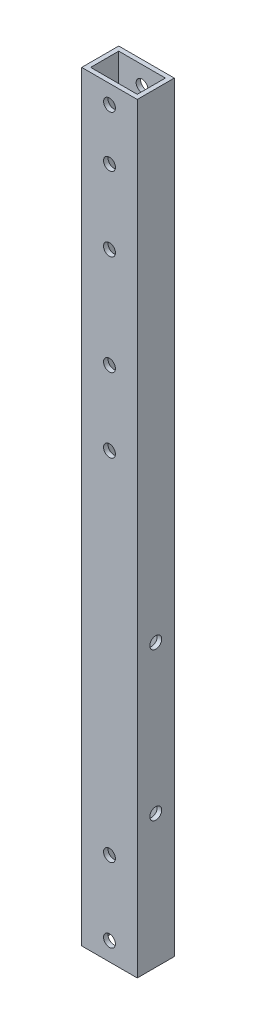
ISO-10303-21;
HEADER;
FILE_DESCRIPTION(('STEP AP214'),'2;1');
FILE_NAME('part.step','',(''),(''),'','','');
FILE_SCHEMA(('AUTOMOTIVE_DESIGN { 1 0 10303 214 1 1 1 1 }'));
ENDSEC;
DATA;
#1=APPLICATION_CONTEXT('core data for automotive mechanical design processes');
#2=APPLICATION_PROTOCOL_DEFINITION('international standard','automotive_design',2000,#1);
#3=PRODUCT_CONTEXT('',#1,'mechanical');
#4=PRODUCT('Part','Part','',(#3));
#5=PRODUCT_RELATED_PRODUCT_CATEGORY('part','',(#4));
#6=PRODUCT_DEFINITION_FORMATION('','',#4);
#7=PRODUCT_DEFINITION_CONTEXT('part definition',#1,'design');
#8=PRODUCT_DEFINITION('design','',#6,#7);
#9=PRODUCT_DEFINITION_SHAPE('','',#8);
#10=(LENGTH_UNIT() NAMED_UNIT(*) SI_UNIT(.MILLI.,.METRE.));
#11=(NAMED_UNIT(*) PLANE_ANGLE_UNIT() SI_UNIT($,.RADIAN.));
#12=(NAMED_UNIT(*) SI_UNIT($,.STERADIAN.) SOLID_ANGLE_UNIT());
#13=UNCERTAINTY_MEASURE_WITH_UNIT(LENGTH_MEASURE(1.E-05),#10,'distance_accuracy_value','');
#14=(GEOMETRIC_REPRESENTATION_CONTEXT(3) GLOBAL_UNCERTAINTY_ASSIGNED_CONTEXT((#13)) GLOBAL_UNIT_ASSIGNED_CONTEXT((#10,
#11,#12)) REPRESENTATION_CONTEXT('',''));
#15=CARTESIAN_POINT('',(0.,0.,0.));
#16=DIRECTION('',(0.,0.,1.));
#17=DIRECTION('',(1.,0.,0.));
#18=AXIS2_PLACEMENT_3D('',#15,#16,#17);
#19=CARTESIAN_POINT('',(7.5,110.,-5.));
#20=DIRECTION('',(-1.,0.,0.));
#21=DIRECTION('',(0.,0.,1.));
#22=AXIS2_PLACEMENT_3D('',#19,#20,#21);
#23=PLANE('',#22);
#24=CARTESIAN_POINT('',(7.5,-74.,0.));
#25=DIRECTION('',(1.,0.,0.));
#26=DIRECTION('',(0.,0.,-1.));
#27=AXIS2_PLACEMENT_3D('',#24,#25,#26);
#28=CIRCLE('',#27,1.60000000000001);
#29=CARTESIAN_POINT('',(7.5,-74.,-1.60000000000001));
#30=VERTEX_POINT('',#29);
#31=EDGE_CURVE('E261',#30,#30,#28,.T.);
#32=ORIENTED_EDGE('',*,*,#31,.F.);
#33=EDGE_LOOP('',(#32));
#34=FACE_BOUND('',#33,.T.);
#35=CARTESIAN_POINT('',(7.5,-34.,0.));
#36=DIRECTION('',(1.,0.,0.));
#37=DIRECTION('',(0.,0.,-1.));
#38=AXIS2_PLACEMENT_3D('',#35,#36,#37);
#39=CIRCLE('',#38,1.6);
#40=CARTESIAN_POINT('',(7.5,-34.,-1.6));
#41=VERTEX_POINT('',#40);
#42=EDGE_CURVE('E265',#41,#41,#39,.T.);
#43=ORIENTED_EDGE('',*,*,#42,.F.);
#44=EDGE_LOOP('',(#43));
#45=FACE_BOUND('',#44,.T.);
#46=DIRECTION('',(0.,0.,-1.));
#47=VECTOR('',#46,1.);
#48=CARTESIAN_POINT('',(7.5,95.5,5.));
#49=LINE('',#48,#47);
#50=CARTESIAN_POINT('',(7.5,95.5,5.));
#51=VERTEX_POINT('',#50);
#52=CARTESIAN_POINT('',(7.5,95.5,-5.));
#53=VERTEX_POINT('',#52);
#54=EDGE_CURVE('E111',#51,#53,#49,.T.);
#55=ORIENTED_EDGE('',*,*,#54,.F.);
#56=DIRECTION('',(0.,-1.,0.));
#57=VECTOR('',#56,1.);
#58=CARTESIAN_POINT('',(7.5,110.,5.));
#59=LINE('',#58,#57);
#60=CARTESIAN_POINT('',(7.5,-110.,5.));
#61=VERTEX_POINT('',#60);
#62=EDGE_CURVE('E122',#51,#61,#59,.T.);
#63=ORIENTED_EDGE('',*,*,#62,.T.);
#64=DIRECTION('',(0.,0.,-1.));
#65=VECTOR('',#64,1.);
#66=CARTESIAN_POINT('',(7.5,-110.,-5.));
#67=LINE('',#66,#65);
#68=CARTESIAN_POINT('',(7.5,-110.,-5.));
#69=VERTEX_POINT('',#68);
#70=EDGE_CURVE('E330',#61,#69,#67,.T.);
#71=ORIENTED_EDGE('',*,*,#70,.T.);
#72=DIRECTION('',(0.,-1.,0.));
#73=VECTOR('',#72,1.);
#74=CARTESIAN_POINT('',(7.5,110.,-5.));
#75=LINE('',#74,#73);
#76=EDGE_CURVE('E54',#53,#69,#75,.T.);
#77=ORIENTED_EDGE('',*,*,#76,.F.);
#78=EDGE_LOOP('',(#55,#63,#71,#77));
#79=FACE_BOUND('',#78,.T.);
#80=ADVANCED_FACE('F45',(#34,#45,#79),#23,.F.);
#81=CARTESIAN_POINT('',(-7.5,110.,-5.));
#82=DIRECTION('',(0.,0.,1.));
#83=DIRECTION('',(1.,0.,0.));
#84=AXIS2_PLACEMENT_3D('',#81,#82,#83);
#85=PLANE('',#84);
#86=CARTESIAN_POINT('',(0.,9.60000000000005,-5.));
#87=DIRECTION('',(0.,0.,-1.));
#88=DIRECTION('',(-1.,0.,0.));
#89=AXIS2_PLACEMENT_3D('',#86,#87,#88);
#90=CIRCLE('',#89,1.6);
#91=CARTESIAN_POINT('',(-1.59999999999996,9.60000000000005,-5.));
#92=VERTEX_POINT('',#91);
#93=EDGE_CURVE('E198',#92,#92,#90,.T.);
#94=ORIENTED_EDGE('',*,*,#93,.F.);
#95=EDGE_LOOP('',(#94));
#96=FACE_BOUND('',#95,.T.);
#97=CARTESIAN_POINT('',(0.,29.6000000000001,-5.));
#98=DIRECTION('',(0.,0.,-1.));
#99=DIRECTION('',(-1.,0.,0.));
#100=AXIS2_PLACEMENT_3D('',#97,#98,#99);
#101=CIRCLE('',#100,1.6);
#102=CARTESIAN_POINT('',(-1.59999999999998,29.6000000000001,-5.));
#103=VERTEX_POINT('',#102);
#104=EDGE_CURVE('E204',#103,#103,#101,.T.);
#105=ORIENTED_EDGE('',*,*,#104,.F.);
#106=EDGE_LOOP('',(#105));
#107=FACE_BOUND('',#106,.T.);
#108=CARTESIAN_POINT('',(0.,90.5,-5.));
#109=DIRECTION('',(0.,0.,-1.));
#110=DIRECTION('',(-1.,0.,0.));
#111=AXIS2_PLACEMENT_3D('',#108,#109,#110);
#112=CIRCLE('',#111,1.6);
#113=CARTESIAN_POINT('',(-1.6,90.5,-5.));
#114=VERTEX_POINT('',#113);
#115=EDGE_CURVE('E174',#114,#114,#112,.T.);
#116=ORIENTED_EDGE('',*,*,#115,.F.);
#117=EDGE_LOOP('',(#116));
#118=FACE_BOUND('',#117,.T.);
#119=CARTESIAN_POINT('',(0.,76.66,-5.));
#120=DIRECTION('',(0.,0.,-1.));
#121=DIRECTION('',(-1.,0.,0.));
#122=AXIS2_PLACEMENT_3D('',#119,#120,#121);
#123=CIRCLE('',#122,1.6);
#124=CARTESIAN_POINT('',(-1.6,76.66,-5.));
#125=VERTEX_POINT('',#124);
#126=EDGE_CURVE('E222',#125,#125,#123,.T.);
#127=ORIENTED_EDGE('',*,*,#126,.F.);
#128=EDGE_LOOP('',(#127));
#129=FACE_BOUND('',#128,.T.);
#130=CARTESIAN_POINT('',(0.,56.66,-5.));
#131=DIRECTION('',(0.,0.,-1.));
#132=DIRECTION('',(-1.,0.,0.));
#133=AXIS2_PLACEMENT_3D('',#130,#131,#132);
#134=CIRCLE('',#133,1.6);
#135=CARTESIAN_POINT('',(-1.6,56.66,-5.));
#136=VERTEX_POINT('',#135);
#137=EDGE_CURVE('E218',#136,#136,#134,.T.);
#138=ORIENTED_EDGE('',*,*,#137,.F.);
#139=EDGE_LOOP('',(#138));
#140=FACE_BOUND('',#139,.T.);
#141=CARTESIAN_POINT('',(0.,-105.,-5.));
#142=DIRECTION('',(0.,0.,-1.));
#143=DIRECTION('',(-1.,0.,0.));
#144=AXIS2_PLACEMENT_3D('',#141,#142,#143);
#145=CIRCLE('',#144,1.60000000000001);
#146=CARTESIAN_POINT('',(-1.60000000000001,-105.,-5.));
#147=VERTEX_POINT('',#146);
#148=EDGE_CURVE('E282',#147,#147,#145,.T.);
#149=ORIENTED_EDGE('',*,*,#148,.F.);
#150=EDGE_LOOP('',(#149));
#151=FACE_BOUND('',#150,.T.);
#152=CARTESIAN_POINT('',(0.,-85.,-5.));
#153=DIRECTION('',(0.,0.,-1.));
#154=DIRECTION('',(-1.,0.,0.));
#155=AXIS2_PLACEMENT_3D('',#152,#153,#154);
#156=CIRCLE('',#155,1.6);
#157=CARTESIAN_POINT('',(-1.6,-85.,-5.));
#158=VERTEX_POINT('',#157);
#159=EDGE_CURVE('E151',#158,#158,#156,.T.);
#160=ORIENTED_EDGE('',*,*,#159,.F.);
#161=EDGE_LOOP('',(#160));
#162=FACE_BOUND('',#161,.T.);
#163=DIRECTION('',(-1.,0.,0.));
#164=VECTOR('',#163,1.);
#165=CARTESIAN_POINT('',(7.5,95.5,-5.));
#166=LINE('',#165,#164);
#167=CARTESIAN_POINT('',(-7.5,95.5,-5.));
#168=VERTEX_POINT('',#167);
#169=EDGE_CURVE('E125',#53,#168,#166,.T.);
#170=ORIENTED_EDGE('',*,*,#169,.F.);
#171=ORIENTED_EDGE('',*,*,#76,.T.);
#172=DIRECTION('',(-1.,0.,0.));
#173=VECTOR('',#172,1.);
#174=CARTESIAN_POINT('',(-7.5,-110.,-5.));
#175=LINE('',#174,#173);
#176=CARTESIAN_POINT('',(-7.5,-110.,-5.));
#177=VERTEX_POINT('',#176);
#178=EDGE_CURVE('E333',#69,#177,#175,.T.);
#179=ORIENTED_EDGE('',*,*,#178,.T.);
#180=DIRECTION('',(0.,-1.,0.));
#181=VECTOR('',#180,1.);
#182=CARTESIAN_POINT('',(-7.5,110.,-5.));
#183=LINE('',#182,#181);
#184=EDGE_CURVE('E136',#168,#177,#183,.T.);
#185=ORIENTED_EDGE('',*,*,#184,.F.);
#186=EDGE_LOOP('',(#170,#171,#179,#185));
#187=FACE_BOUND('',#186,.T.);
#188=ADVANCED_FACE('F347',(#96,#107,#118,#129,#140,#151,#162,#187),#85,.F.);
#189=CARTESIAN_POINT('',(-7.5,110.,-5.));
#190=DIRECTION('',(1.,0.,0.));
#191=DIRECTION('',(0.,0.,-1.));
#192=AXIS2_PLACEMENT_3D('',#189,#190,#191);
#193=PLANE('',#192);
#194=CARTESIAN_POINT('',(-7.5,-74.,0.));
#195=DIRECTION('',(1.,0.,0.));
#196=DIRECTION('',(0.,0.,-1.));
#197=AXIS2_PLACEMENT_3D('',#194,#195,#196);
#198=CIRCLE('',#197,1.60000000000001);
#199=CARTESIAN_POINT('',(-7.5,-74.,-1.60000000000001));
#200=VERTEX_POINT('',#199);
#201=EDGE_CURVE('E269',#200,#200,#198,.T.);
#202=ORIENTED_EDGE('',*,*,#201,.T.);
#203=EDGE_LOOP('',(#202));
#204=FACE_BOUND('',#203,.T.);
#205=CARTESIAN_POINT('',(-7.5,-34.,0.));
#206=DIRECTION('',(1.,0.,0.));
#207=DIRECTION('',(0.,0.,-1.));
#208=AXIS2_PLACEMENT_3D('',#205,#206,#207);
#209=CIRCLE('',#208,1.6);
#210=CARTESIAN_POINT('',(-7.5,-34.,-1.6));
#211=VERTEX_POINT('',#210);
#212=EDGE_CURVE('E163',#211,#211,#209,.T.);
#213=ORIENTED_EDGE('',*,*,#212,.T.);
#214=EDGE_LOOP('',(#213));
#215=FACE_BOUND('',#214,.T.);
#216=DIRECTION('',(0.,0.,1.));
#217=VECTOR('',#216,1.);
#218=CARTESIAN_POINT('',(-7.5,95.5,-5.));
#219=LINE('',#218,#217);
#220=CARTESIAN_POINT('',(-7.5,95.5,5.));
#221=VERTEX_POINT('',#220);
#222=EDGE_CURVE('E62',#168,#221,#219,.T.);
#223=ORIENTED_EDGE('',*,*,#222,.F.);
#224=ORIENTED_EDGE('',*,*,#184,.T.);
#225=DIRECTION('',(0.,0.,1.));
#226=VECTOR('',#225,1.);
#227=CARTESIAN_POINT('',(-7.5,-110.,-5.));
#228=LINE('',#227,#226);
#229=CARTESIAN_POINT('',(-7.5,-110.,5.));
#230=VERTEX_POINT('',#229);
#231=EDGE_CURVE('E138',#177,#230,#228,.T.);
#232=ORIENTED_EDGE('',*,*,#231,.T.);
#233=DIRECTION('',(0.,-1.,0.));
#234=VECTOR('',#233,1.);
#235=CARTESIAN_POINT('',(-7.5,110.,5.));
#236=LINE('',#235,#234);
#237=EDGE_CURVE('E132',#221,#230,#236,.T.);
#238=ORIENTED_EDGE('',*,*,#237,.F.);
#239=EDGE_LOOP('',(#223,#224,#232,#238));
#240=FACE_BOUND('',#239,.T.);
#241=ADVANCED_FACE('F340',(#204,#215,#240),#193,.F.);
#242=CARTESIAN_POINT('',(-7.5,110.,5.));
#243=DIRECTION('',(0.,0.,-1.));
#244=DIRECTION('',(-1.,0.,0.));
#245=AXIS2_PLACEMENT_3D('',#242,#243,#244);
#246=PLANE('',#245);
#247=CARTESIAN_POINT('',(0.,9.60000000000005,5.));
#248=DIRECTION('',(0.,0.,-1.));
#249=DIRECTION('',(-1.,0.,0.));
#250=AXIS2_PLACEMENT_3D('',#247,#248,#249);
#251=CIRCLE('',#250,1.6);
#252=CARTESIAN_POINT('',(-1.59999999999996,9.60000000000005,5.));
#253=VERTEX_POINT('',#252);
#254=EDGE_CURVE('E190',#253,#253,#251,.T.);
#255=ORIENTED_EDGE('',*,*,#254,.T.);
#256=EDGE_LOOP('',(#255));
#257=FACE_BOUND('',#256,.T.);
#258=CARTESIAN_POINT('',(0.,29.6000000000001,5.));
#259=DIRECTION('',(0.,0.,-1.));
#260=DIRECTION('',(-1.,0.,0.));
#261=AXIS2_PLACEMENT_3D('',#258,#259,#260);
#262=CIRCLE('',#261,1.6);
#263=CARTESIAN_POINT('',(-1.59999999999998,29.6000000000001,5.));
#264=VERTEX_POINT('',#263);
#265=EDGE_CURVE('E210',#264,#264,#262,.T.);
#266=ORIENTED_EDGE('',*,*,#265,.T.);
#267=EDGE_LOOP('',(#266));
#268=FACE_BOUND('',#267,.T.);
#269=CARTESIAN_POINT('',(0.,90.5,5.));
#270=DIRECTION('',(0.,0.,-1.));
#271=DIRECTION('',(-1.,0.,0.));
#272=AXIS2_PLACEMENT_3D('',#269,#270,#271);
#273=CIRCLE('',#272,1.6);
#274=CARTESIAN_POINT('',(-1.6,90.5,5.));
#275=VERTEX_POINT('',#274);
#276=EDGE_CURVE('E117',#275,#275,#273,.T.);
#277=ORIENTED_EDGE('',*,*,#276,.T.);
#278=EDGE_LOOP('',(#277));
#279=FACE_BOUND('',#278,.T.);
#280=CARTESIAN_POINT('',(0.,76.66,5.));
#281=DIRECTION('',(0.,0.,-1.));
#282=DIRECTION('',(-1.,0.,0.));
#283=AXIS2_PLACEMENT_3D('',#280,#281,#282);
#284=CIRCLE('',#283,1.6);
#285=CARTESIAN_POINT('',(-1.6,76.66,5.));
#286=VERTEX_POINT('',#285);
#287=EDGE_CURVE('E185',#286,#286,#284,.T.);
#288=ORIENTED_EDGE('',*,*,#287,.T.);
#289=EDGE_LOOP('',(#288));
#290=FACE_BOUND('',#289,.T.);
#291=CARTESIAN_POINT('',(0.,56.66,5.));
#292=DIRECTION('',(0.,0.,-1.));
#293=DIRECTION('',(-1.,0.,0.));
#294=AXIS2_PLACEMENT_3D('',#291,#292,#293);
#295=CIRCLE('',#294,1.6);
#296=CARTESIAN_POINT('',(-1.6,56.66,5.));
#297=VERTEX_POINT('',#296);
#298=EDGE_CURVE('E180',#297,#297,#295,.T.);
#299=ORIENTED_EDGE('',*,*,#298,.T.);
#300=EDGE_LOOP('',(#299));
#301=FACE_BOUND('',#300,.T.);
#302=CARTESIAN_POINT('',(0.,-105.,5.));
#303=DIRECTION('',(0.,0.,-1.));
#304=DIRECTION('',(-1.,0.,0.));
#305=AXIS2_PLACEMENT_3D('',#302,#303,#304);
#306=CIRCLE('',#305,1.60000000000001);
#307=CARTESIAN_POINT('',(-1.60000000000001,-105.,5.));
#308=VERTEX_POINT('',#307);
#309=EDGE_CURVE('E157',#308,#308,#306,.T.);
#310=ORIENTED_EDGE('',*,*,#309,.T.);
#311=EDGE_LOOP('',(#310));
#312=FACE_BOUND('',#311,.T.);
#313=CARTESIAN_POINT('',(0.,-85.,5.));
#314=DIRECTION('',(0.,0.,-1.));
#315=DIRECTION('',(-1.,0.,0.));
#316=AXIS2_PLACEMENT_3D('',#313,#314,#315);
#317=CIRCLE('',#316,1.6);
#318=CARTESIAN_POINT('',(-1.6,-85.,5.));
#319=VERTEX_POINT('',#318);
#320=EDGE_CURVE('E298',#319,#319,#317,.T.);
#321=ORIENTED_EDGE('',*,*,#320,.T.);
#322=EDGE_LOOP('',(#321));
#323=FACE_BOUND('',#322,.T.);
#324=DIRECTION('',(1.,0.,0.));
#325=VECTOR('',#324,1.);
#326=CARTESIAN_POINT('',(-7.5,95.5,5.));
#327=LINE('',#326,#325);
#328=EDGE_CURVE('E108',#221,#51,#327,.T.);
#329=ORIENTED_EDGE('',*,*,#328,.F.);
#330=ORIENTED_EDGE('',*,*,#237,.T.);
#331=DIRECTION('',(1.,0.,0.));
#332=VECTOR('',#331,1.);
#333=CARTESIAN_POINT('',(-7.5,-110.,5.));
#334=LINE('',#333,#332);
#335=EDGE_CURVE('E129',#230,#61,#334,.T.);
#336=ORIENTED_EDGE('',*,*,#335,.T.);
#337=ORIENTED_EDGE('',*,*,#62,.F.);
#338=EDGE_LOOP('',(#329,#330,#336,#337));
#339=FACE_BOUND('',#338,.T.);
#340=ADVANCED_FACE('F127',(#257,#268,#279,#290,#301,#312,#323,#339),#246,.F.);
#341=CARTESIAN_POINT('',(-6.3,110.,-3.8));
#342=DIRECTION('',(1.,0.,0.));
#343=DIRECTION('',(0.,0.,-1.));
#344=AXIS2_PLACEMENT_3D('',#341,#342,#343);
#345=PLANE('',#344);
#346=CARTESIAN_POINT('',(-6.3,-34.,0.));
#347=DIRECTION('',(1.,0.,0.));
#348=DIRECTION('',(0.,0.,-1.));
#349=AXIS2_PLACEMENT_3D('',#346,#347,#348);
#350=CIRCLE('',#349,1.6);
#351=CARTESIAN_POINT('',(-6.3,-34.,-1.6));
#352=VERTEX_POINT('',#351);
#353=EDGE_CURVE('E167',#352,#352,#350,.T.);
#354=ORIENTED_EDGE('',*,*,#353,.F.);
#355=EDGE_LOOP('',(#354));
#356=FACE_BOUND('',#355,.T.);
#357=CARTESIAN_POINT('',(-6.3,-74.,0.));
#358=DIRECTION('',(1.,0.,0.));
#359=DIRECTION('',(0.,0.,-1.));
#360=AXIS2_PLACEMENT_3D('',#357,#358,#359);
#361=CIRCLE('',#360,1.60000000000001);
#362=CARTESIAN_POINT('',(-6.3,-74.,-1.60000000000001));
#363=VERTEX_POINT('',#362);
#364=EDGE_CURVE('E162',#363,#363,#361,.T.);
#365=ORIENTED_EDGE('',*,*,#364,.F.);
#366=EDGE_LOOP('',(#365));
#367=FACE_BOUND('',#366,.T.);
#368=DIRECTION('',(0.,-1.,0.));
#369=VECTOR('',#368,1.);
#370=CARTESIAN_POINT('',(-6.3,110.,-3.8));
#371=LINE('',#370,#369);
#372=CARTESIAN_POINT('',(-6.3,95.5,-3.8));
#373=VERTEX_POINT('',#372);
#374=CARTESIAN_POINT('',(-6.3,-110.,-3.8));
#375=VERTEX_POINT('',#374);
#376=EDGE_CURVE('E318',#373,#375,#371,.T.);
#377=ORIENTED_EDGE('',*,*,#376,.F.);
#378=DIRECTION('',(0.,0.,1.));
#379=VECTOR('',#378,1.);
#380=CARTESIAN_POINT('',(-6.3,95.5,-3.8));
#381=LINE('',#380,#379);
#382=CARTESIAN_POINT('',(-6.3,95.5,3.8));
#383=VERTEX_POINT('',#382);
#384=EDGE_CURVE('E70',#373,#383,#381,.T.);
#385=ORIENTED_EDGE('',*,*,#384,.T.);
#386=DIRECTION('',(0.,-1.,0.));
#387=VECTOR('',#386,1.);
#388=CARTESIAN_POINT('',(-6.3,110.,3.8));
#389=LINE('',#388,#387);
#390=CARTESIAN_POINT('',(-6.3,-110.,3.8));
#391=VERTEX_POINT('',#390);
#392=EDGE_CURVE('E327',#383,#391,#389,.T.);
#393=ORIENTED_EDGE('',*,*,#392,.T.);
#394=DIRECTION('',(0.,0.,1.));
#395=VECTOR('',#394,1.);
#396=CARTESIAN_POINT('',(-6.3,-110.,-3.8));
#397=LINE('',#396,#395);
#398=EDGE_CURVE('E302',#375,#391,#397,.T.);
#399=ORIENTED_EDGE('',*,*,#398,.F.);
#400=EDGE_LOOP('',(#377,#385,#393,#399));
#401=FACE_BOUND('',#400,.T.);
#402=ADVANCED_FACE('F363',(#356,#367,#401),#345,.T.);
#403=CARTESIAN_POINT('',(-6.3,110.,3.8));
#404=DIRECTION('',(0.,0.,-1.));
#405=DIRECTION('',(-1.,0.,0.));
#406=AXIS2_PLACEMENT_3D('',#403,#404,#405);
#407=PLANE('',#406);
#408=CARTESIAN_POINT('',(0.,9.60000000000005,3.8));
#409=DIRECTION('',(0.,0.,-1.));
#410=DIRECTION('',(-1.,0.,0.));
#411=AXIS2_PLACEMENT_3D('',#408,#409,#410);
#412=CIRCLE('',#411,1.6);
#413=CARTESIAN_POINT('',(-1.59999999999996,9.60000000000005,3.8));
#414=VERTEX_POINT('',#413);
#415=EDGE_CURVE('E214',#414,#414,#412,.T.);
#416=ORIENTED_EDGE('',*,*,#415,.F.);
#417=EDGE_LOOP('',(#416));
#418=FACE_BOUND('',#417,.T.);
#419=CARTESIAN_POINT('',(0.,29.6000000000001,3.8));
#420=DIRECTION('',(0.,0.,-1.));
#421=DIRECTION('',(-1.,0.,0.));
#422=AXIS2_PLACEMENT_3D('',#419,#420,#421);
#423=CIRCLE('',#422,1.6);
#424=CARTESIAN_POINT('',(-1.59999999999998,29.6000000000001,3.8));
#425=VERTEX_POINT('',#424);
#426=EDGE_CURVE('E189',#425,#425,#423,.T.);
#427=ORIENTED_EDGE('',*,*,#426,.F.);
#428=EDGE_LOOP('',(#427));
#429=FACE_BOUND('',#428,.T.);
#430=CARTESIAN_POINT('',(0.,90.5,3.8));
#431=DIRECTION('',(0.,0.,-1.));
#432=DIRECTION('',(-1.,0.,0.));
#433=AXIS2_PLACEMENT_3D('',#430,#431,#432);
#434=CIRCLE('',#433,1.6);
#435=CARTESIAN_POINT('',(-1.6,90.5,3.8));
#436=VERTEX_POINT('',#435);
#437=EDGE_CURVE('E184',#436,#436,#434,.T.);
#438=ORIENTED_EDGE('',*,*,#437,.F.);
#439=EDGE_LOOP('',(#438));
#440=FACE_BOUND('',#439,.T.);
#441=CARTESIAN_POINT('',(0.,76.66,3.8));
#442=DIRECTION('',(0.,0.,-1.));
#443=DIRECTION('',(-1.,0.,0.));
#444=AXIS2_PLACEMENT_3D('',#441,#442,#443);
#445=CIRCLE('',#444,1.6);
#446=CARTESIAN_POINT('',(-1.6,76.66,3.8));
#447=VERTEX_POINT('',#446);
#448=EDGE_CURVE('E179',#447,#447,#445,.T.);
#449=ORIENTED_EDGE('',*,*,#448,.F.);
#450=EDGE_LOOP('',(#449));
#451=FACE_BOUND('',#450,.T.);
#452=CARTESIAN_POINT('',(0.,56.66,3.8));
#453=DIRECTION('',(0.,0.,-1.));
#454=DIRECTION('',(-1.,0.,0.));
#455=AXIS2_PLACEMENT_3D('',#452,#453,#454);
#456=CIRCLE('',#455,1.6);
#457=CARTESIAN_POINT('',(-1.6,56.66,3.8));
#458=VERTEX_POINT('',#457);
#459=EDGE_CURVE('E173',#458,#458,#456,.T.);
#460=ORIENTED_EDGE('',*,*,#459,.F.);
#461=EDGE_LOOP('',(#460));
#462=FACE_BOUND('',#461,.T.);
#463=CARTESIAN_POINT('',(0.,-85.,3.8));
#464=DIRECTION('',(0.,0.,-1.));
#465=DIRECTION('',(-1.,0.,0.));
#466=AXIS2_PLACEMENT_3D('',#463,#464,#465);
#467=CIRCLE('',#466,1.6);
#468=CARTESIAN_POINT('',(-1.6,-85.,3.8));
#469=VERTEX_POINT('',#468);
#470=EDGE_CURVE('E156',#469,#469,#467,.T.);
#471=ORIENTED_EDGE('',*,*,#470,.F.);
#472=EDGE_LOOP('',(#471));
#473=FACE_BOUND('',#472,.T.);
#474=CARTESIAN_POINT('',(0.,-105.,3.8));
#475=DIRECTION('',(0.,0.,-1.));
#476=DIRECTION('',(-1.,0.,0.));
#477=AXIS2_PLACEMENT_3D('',#474,#475,#476);
#478=CIRCLE('',#477,1.60000000000001);
#479=CARTESIAN_POINT('',(-1.60000000000001,-105.,3.8));
#480=VERTEX_POINT('',#479);
#481=EDGE_CURVE('E150',#480,#480,#478,.T.);
#482=ORIENTED_EDGE('',*,*,#481,.F.);
#483=EDGE_LOOP('',(#482));
#484=FACE_BOUND('',#483,.T.);
#485=ORIENTED_EDGE('',*,*,#392,.F.);
#486=DIRECTION('',(1.,0.,0.));
#487=VECTOR('',#486,1.);
#488=CARTESIAN_POINT('',(-6.3,95.5,3.8));
#489=LINE('',#488,#487);
#490=CARTESIAN_POINT('',(6.3,95.5,3.8));
#491=VERTEX_POINT('',#490);
#492=EDGE_CURVE('E255',#383,#491,#489,.T.);
#493=ORIENTED_EDGE('',*,*,#492,.T.);
#494=DIRECTION('',(0.,-1.,0.));
#495=VECTOR('',#494,1.);
#496=CARTESIAN_POINT('',(6.3,110.,3.8));
#497=LINE('',#496,#495);
#498=CARTESIAN_POINT('',(6.3,-110.,3.8));
#499=VERTEX_POINT('',#498);
#500=EDGE_CURVE('E324',#491,#499,#497,.T.);
#501=ORIENTED_EDGE('',*,*,#500,.T.);
#502=DIRECTION('',(1.,0.,0.));
#503=VECTOR('',#502,1.);
#504=CARTESIAN_POINT('',(-6.3,-110.,3.8));
#505=LINE('',#504,#503);
#506=EDGE_CURVE('E306',#391,#499,#505,.T.);
#507=ORIENTED_EDGE('',*,*,#506,.F.);
#508=EDGE_LOOP('',(#485,#493,#501,#507));
#509=FACE_BOUND('',#508,.T.);
#510=ADVANCED_FACE('F370',(#418,#429,#440,#451,#462,#473,#484,#509),#407,.T.);
#511=CARTESIAN_POINT('',(6.3,110.,-3.8));
#512=DIRECTION('',(-1.,0.,0.));
#513=DIRECTION('',(0.,0.,1.));
#514=AXIS2_PLACEMENT_3D('',#511,#512,#513);
#515=PLANE('',#514);
#516=CARTESIAN_POINT('',(6.3,-34.,0.));
#517=DIRECTION('',(-1.,0.,0.));
#518=DIRECTION('',(0.,0.,1.));
#519=AXIS2_PLACEMENT_3D('',#516,#517,#518);
#520=CIRCLE('',#519,1.6);
#521=CARTESIAN_POINT('',(6.3,-34.,1.6));
#522=VERTEX_POINT('',#521);
#523=EDGE_CURVE('E164',#522,#522,#520,.T.);
#524=ORIENTED_EDGE('',*,*,#523,.F.);
#525=EDGE_LOOP('',(#524));
#526=FACE_BOUND('',#525,.T.);
#527=CARTESIAN_POINT('',(6.3,-74.,0.));
#528=DIRECTION('',(-1.,0.,0.));
#529=DIRECTION('',(0.,0.,1.));
#530=AXIS2_PLACEMENT_3D('',#527,#528,#529);
#531=CIRCLE('',#530,1.60000000000001);
#532=CARTESIAN_POINT('',(6.3,-74.,1.60000000000001));
#533=VERTEX_POINT('',#532);
#534=EDGE_CURVE('E158',#533,#533,#531,.T.);
#535=ORIENTED_EDGE('',*,*,#534,.F.);
#536=EDGE_LOOP('',(#535));
#537=FACE_BOUND('',#536,.T.);
#538=ORIENTED_EDGE('',*,*,#500,.F.);
#539=DIRECTION('',(0.,0.,-1.));
#540=VECTOR('',#539,1.);
#541=CARTESIAN_POINT('',(6.3,95.5,-3.8));
#542=LINE('',#541,#540);
#543=CARTESIAN_POINT('',(6.3,95.5,-3.8));
#544=VERTEX_POINT('',#543);
#545=EDGE_CURVE('E251',#491,#544,#542,.T.);
#546=ORIENTED_EDGE('',*,*,#545,.T.);
#547=DIRECTION('',(0.,-1.,0.));
#548=VECTOR('',#547,1.);
#549=CARTESIAN_POINT('',(6.3,110.,-3.8));
#550=LINE('',#549,#548);
#551=CARTESIAN_POINT('',(6.3,-110.,-3.8));
#552=VERTEX_POINT('',#551);
#553=EDGE_CURVE('E321',#544,#552,#550,.T.);
#554=ORIENTED_EDGE('',*,*,#553,.T.);
#555=DIRECTION('',(0.,0.,-1.));
#556=VECTOR('',#555,1.);
#557=CARTESIAN_POINT('',(6.3,-110.,-3.8));
#558=LINE('',#557,#556);
#559=EDGE_CURVE('E310',#499,#552,#558,.T.);
#560=ORIENTED_EDGE('',*,*,#559,.F.);
#561=EDGE_LOOP('',(#538,#546,#554,#560));
#562=FACE_BOUND('',#561,.T.);
#563=ADVANCED_FACE('F374',(#526,#537,#562),#515,.T.);
#564=CARTESIAN_POINT('',(-6.3,110.,-3.8));
#565=DIRECTION('',(0.,0.,1.));
#566=DIRECTION('',(1.,0.,0.));
#567=AXIS2_PLACEMENT_3D('',#564,#565,#566);
#568=PLANE('',#567);
#569=CARTESIAN_POINT('',(0.,9.60000000000005,-3.8));
#570=DIRECTION('',(0.,0.,1.));
#571=DIRECTION('',(1.,0.,0.));
#572=AXIS2_PLACEMENT_3D('',#569,#570,#571);
#573=CIRCLE('',#572,1.6);
#574=CARTESIAN_POINT('',(1.60000000000005,9.60000000000005,-3.8));
#575=VERTEX_POINT('',#574);
#576=EDGE_CURVE('E48',#575,#575,#573,.T.);
#577=ORIENTED_EDGE('',*,*,#576,.F.);
#578=EDGE_LOOP('',(#577));
#579=FACE_BOUND('',#578,.T.);
#580=CARTESIAN_POINT('',(0.,29.6000000000001,-3.8));
#581=DIRECTION('',(0.,0.,1.));
#582=DIRECTION('',(1.,0.,0.));
#583=AXIS2_PLACEMENT_3D('',#580,#581,#582);
#584=CIRCLE('',#583,1.6);
#585=CARTESIAN_POINT('',(1.60000000000003,29.6000000000001,-3.8));
#586=VERTEX_POINT('',#585);
#587=EDGE_CURVE('E186',#586,#586,#584,.T.);
#588=ORIENTED_EDGE('',*,*,#587,.F.);
#589=EDGE_LOOP('',(#588));
#590=FACE_BOUND('',#589,.T.);
#591=CARTESIAN_POINT('',(0.,90.5,-3.8));
#592=DIRECTION('',(0.,0.,1.));
#593=DIRECTION('',(1.,0.,0.));
#594=AXIS2_PLACEMENT_3D('',#591,#592,#593);
#595=CIRCLE('',#594,1.6);
#596=CARTESIAN_POINT('',(1.6,90.5,-3.8));
#597=VERTEX_POINT('',#596);
#598=EDGE_CURVE('E181',#597,#597,#595,.T.);
#599=ORIENTED_EDGE('',*,*,#598,.F.);
#600=EDGE_LOOP('',(#599));
#601=FACE_BOUND('',#600,.T.);
#602=CARTESIAN_POINT('',(0.,76.66,-3.8));
#603=DIRECTION('',(0.,0.,1.));
#604=DIRECTION('',(1.,0.,0.));
#605=AXIS2_PLACEMENT_3D('',#602,#603,#604);
#606=CIRCLE('',#605,1.6);
#607=CARTESIAN_POINT('',(1.6,76.66,-3.8));
#608=VERTEX_POINT('',#607);
#609=EDGE_CURVE('E175',#608,#608,#606,.T.);
#610=ORIENTED_EDGE('',*,*,#609,.F.);
#611=EDGE_LOOP('',(#610));
#612=FACE_BOUND('',#611,.T.);
#613=CARTESIAN_POINT('',(0.,56.66,-3.8));
#614=DIRECTION('',(0.,0.,1.));
#615=DIRECTION('',(1.,0.,0.));
#616=AXIS2_PLACEMENT_3D('',#613,#614,#615);
#617=CIRCLE('',#616,1.6);
#618=CARTESIAN_POINT('',(1.6,56.66,-3.8));
#619=VERTEX_POINT('',#618);
#620=EDGE_CURVE('E169',#619,#619,#617,.T.);
#621=ORIENTED_EDGE('',*,*,#620,.F.);
#622=EDGE_LOOP('',(#621));
#623=FACE_BOUND('',#622,.T.);
#624=CARTESIAN_POINT('',(0.,-85.,-3.8));
#625=DIRECTION('',(0.,0.,1.));
#626=DIRECTION('',(1.,0.,0.));
#627=AXIS2_PLACEMENT_3D('',#624,#625,#626);
#628=CIRCLE('',#627,1.6);
#629=CARTESIAN_POINT('',(1.6,-85.,-3.8));
#630=VERTEX_POINT('',#629);
#631=EDGE_CURVE('E152',#630,#630,#628,.T.);
#632=ORIENTED_EDGE('',*,*,#631,.F.);
#633=EDGE_LOOP('',(#632));
#634=FACE_BOUND('',#633,.T.);
#635=CARTESIAN_POINT('',(0.,-105.,-3.8));
#636=DIRECTION('',(0.,0.,1.));
#637=DIRECTION('',(1.,0.,0.));
#638=AXIS2_PLACEMENT_3D('',#635,#636,#637);
#639=CIRCLE('',#638,1.60000000000001);
#640=CARTESIAN_POINT('',(1.60000000000001,-105.,-3.8));
#641=VERTEX_POINT('',#640);
#642=EDGE_CURVE('E146',#641,#641,#639,.T.);
#643=ORIENTED_EDGE('',*,*,#642,.F.);
#644=EDGE_LOOP('',(#643));
#645=FACE_BOUND('',#644,.T.);
#646=ORIENTED_EDGE('',*,*,#553,.F.);
#647=DIRECTION('',(-1.,0.,0.));
#648=VECTOR('',#647,1.);
#649=CARTESIAN_POINT('',(-6.3,95.5,-3.8));
#650=LINE('',#649,#648);
#651=EDGE_CURVE('E11',#544,#373,#650,.T.);
#652=ORIENTED_EDGE('',*,*,#651,.T.);
#653=ORIENTED_EDGE('',*,*,#376,.T.);
#654=DIRECTION('',(-1.,0.,0.));
#655=VECTOR('',#654,1.);
#656=CARTESIAN_POINT('',(-6.3,-110.,-3.8));
#657=LINE('',#656,#655);
#658=EDGE_CURVE('E314',#552,#375,#657,.T.);
#659=ORIENTED_EDGE('',*,*,#658,.F.);
#660=EDGE_LOOP('',(#646,#652,#653,#659));
#661=FACE_BOUND('',#660,.T.);
#662=ADVANCED_FACE('F367',(#579,#590,#601,#612,#623,#634,#645,#661),#568,.T.);
#663=CARTESIAN_POINT('',(0.,-110.,0.));
#664=DIRECTION('',(0.,1.,0.));
#665=DIRECTION('',(0.,0.,1.));
#666=AXIS2_PLACEMENT_3D('',#663,#664,#665);
#667=PLANE('',#666);
#668=ORIENTED_EDGE('',*,*,#70,.F.);
#669=ORIENTED_EDGE('',*,*,#335,.F.);
#670=ORIENTED_EDGE('',*,*,#231,.F.);
#671=ORIENTED_EDGE('',*,*,#178,.F.);
#672=EDGE_LOOP('',(#668,#669,#670,#671));
#673=FACE_BOUND('',#672,.T.);
#674=ORIENTED_EDGE('',*,*,#398,.T.);
#675=ORIENTED_EDGE('',*,*,#506,.T.);
#676=ORIENTED_EDGE('',*,*,#559,.T.);
#677=ORIENTED_EDGE('',*,*,#658,.T.);
#678=EDGE_LOOP('',(#674,#675,#676,#677));
#679=FACE_BOUND('',#678,.T.);
#680=ADVANCED_FACE('F344',(#673,#679),#667,.F.);
#681=CARTESIAN_POINT('',(0.,-105.,95.));
#682=DIRECTION('',(0.,0.,-1.));
#683=DIRECTION('',(-1.,0.,0.));
#684=AXIS2_PLACEMENT_3D('',#681,#682,#683);
#685=CYLINDRICAL_SURFACE('',#684,1.60000000000001);
#686=ORIENTED_EDGE('',*,*,#642,.T.);
#687=EDGE_LOOP('',(#686));
#688=FACE_BOUND('',#687,.T.);
#689=ORIENTED_EDGE('',*,*,#148,.T.);
#690=EDGE_LOOP('',(#689));
#691=FACE_BOUND('',#690,.T.);
#692=ADVANCED_FACE('F366',(#688,#691),#685,.F.);
#693=CARTESIAN_POINT('',(0.,-85.,95.));
#694=DIRECTION('',(0.,0.,-1.));
#695=DIRECTION('',(-1.,0.,0.));
#696=AXIS2_PLACEMENT_3D('',#693,#694,#695);
#697=CYLINDRICAL_SURFACE('',#696,1.6);
#698=ORIENTED_EDGE('',*,*,#631,.T.);
#699=EDGE_LOOP('',(#698));
#700=FACE_BOUND('',#699,.T.);
#701=ORIENTED_EDGE('',*,*,#159,.T.);
#702=EDGE_LOOP('',(#701));
#703=FACE_BOUND('',#702,.T.);
#704=ADVANCED_FACE('F384',(#700,#703),#697,.F.);
#705=ORIENTED_EDGE('',*,*,#481,.T.);
#706=EDGE_LOOP('',(#705));
#707=FACE_BOUND('',#706,.T.);
#708=ORIENTED_EDGE('',*,*,#309,.F.);
#709=EDGE_LOOP('',(#708));
#710=FACE_BOUND('',#709,.T.);
#711=ADVANCED_FACE('F386',(#707,#710),#685,.F.);
#712=ORIENTED_EDGE('',*,*,#470,.T.);
#713=EDGE_LOOP('',(#712));
#714=FACE_BOUND('',#713,.T.);
#715=ORIENTED_EDGE('',*,*,#320,.F.);
#716=EDGE_LOOP('',(#715));
#717=FACE_BOUND('',#716,.T.);
#718=ADVANCED_FACE('F390',(#714,#717),#697,.F.);
#719=CARTESIAN_POINT('',(-7.5,-74.,0.));
#720=DIRECTION('',(1.,0.,0.));
#721=DIRECTION('',(0.,0.,-1.));
#722=AXIS2_PLACEMENT_3D('',#719,#720,#721);
#723=CYLINDRICAL_SURFACE('',#722,1.60000000000001);
#724=ORIENTED_EDGE('',*,*,#534,.T.);
#725=EDGE_LOOP('',(#724));
#726=FACE_BOUND('',#725,.T.);
#727=ORIENTED_EDGE('',*,*,#31,.T.);
#728=EDGE_LOOP('',(#727));
#729=FACE_BOUND('',#728,.T.);
#730=ADVANCED_FACE('F391',(#726,#729),#723,.F.);
#731=CARTESIAN_POINT('',(-7.5,-34.,0.));
#732=DIRECTION('',(1.,0.,0.));
#733=DIRECTION('',(0.,0.,-1.));
#734=AXIS2_PLACEMENT_3D('',#731,#732,#733);
#735=CYLINDRICAL_SURFACE('',#734,1.6);
#736=ORIENTED_EDGE('',*,*,#523,.T.);
#737=EDGE_LOOP('',(#736));
#738=FACE_BOUND('',#737,.T.);
#739=ORIENTED_EDGE('',*,*,#42,.T.);
#740=EDGE_LOOP('',(#739));
#741=FACE_BOUND('',#740,.T.);
#742=ADVANCED_FACE('F394',(#738,#741),#735,.F.);
#743=ORIENTED_EDGE('',*,*,#364,.T.);
#744=EDGE_LOOP('',(#743));
#745=FACE_BOUND('',#744,.T.);
#746=ORIENTED_EDGE('',*,*,#201,.F.);
#747=EDGE_LOOP('',(#746));
#748=FACE_BOUND('',#747,.T.);
#749=ADVANCED_FACE('F396',(#745,#748),#723,.F.);
#750=ORIENTED_EDGE('',*,*,#353,.T.);
#751=EDGE_LOOP('',(#750));
#752=FACE_BOUND('',#751,.T.);
#753=ORIENTED_EDGE('',*,*,#212,.F.);
#754=EDGE_LOOP('',(#753));
#755=FACE_BOUND('',#754,.T.);
#756=ADVANCED_FACE('F400',(#752,#755),#735,.F.);
#757=CARTESIAN_POINT('',(0.,95.5,0.));
#758=DIRECTION('',(0.,1.,0.));
#759=DIRECTION('',(0.,0.,1.));
#760=AXIS2_PLACEMENT_3D('',#757,#758,#759);
#761=PLANE('',#760);
#762=ORIENTED_EDGE('',*,*,#651,.F.);
#763=ORIENTED_EDGE('',*,*,#545,.F.);
#764=ORIENTED_EDGE('',*,*,#492,.F.);
#765=ORIENTED_EDGE('',*,*,#384,.F.);
#766=EDGE_LOOP('',(#762,#763,#764,#765));
#767=FACE_BOUND('',#766,.T.);
#768=ORIENTED_EDGE('',*,*,#328,.T.);
#769=ORIENTED_EDGE('',*,*,#54,.T.);
#770=ORIENTED_EDGE('',*,*,#169,.T.);
#771=ORIENTED_EDGE('',*,*,#222,.T.);
#772=EDGE_LOOP('',(#768,#769,#770,#771));
#773=FACE_BOUND('',#772,.T.);
#774=ADVANCED_FACE('F110',(#767,#773),#761,.T.);
#775=CARTESIAN_POINT('',(0.,56.66,10.));
#776=DIRECTION('',(0.,0.,-1.));
#777=DIRECTION('',(-1.,0.,0.));
#778=AXIS2_PLACEMENT_3D('',#775,#776,#777);
#779=CYLINDRICAL_SURFACE('',#778,1.6);
#780=ORIENTED_EDGE('',*,*,#620,.T.);
#781=EDGE_LOOP('',(#780));
#782=FACE_BOUND('',#781,.T.);
#783=ORIENTED_EDGE('',*,*,#137,.T.);
#784=EDGE_LOOP('',(#783));
#785=FACE_BOUND('',#784,.T.);
#786=ADVANCED_FACE('F403',(#782,#785),#779,.F.);
#787=CARTESIAN_POINT('',(0.,76.66,10.));
#788=DIRECTION('',(0.,0.,-1.));
#789=DIRECTION('',(-1.,0.,0.));
#790=AXIS2_PLACEMENT_3D('',#787,#788,#789);
#791=CYLINDRICAL_SURFACE('',#790,1.6);
#792=ORIENTED_EDGE('',*,*,#609,.T.);
#793=EDGE_LOOP('',(#792));
#794=FACE_BOUND('',#793,.T.);
#795=ORIENTED_EDGE('',*,*,#126,.T.);
#796=EDGE_LOOP('',(#795));
#797=FACE_BOUND('',#796,.T.);
#798=ADVANCED_FACE('F406',(#794,#797),#791,.F.);
#799=CARTESIAN_POINT('',(0.,90.5,10.));
#800=DIRECTION('',(0.,0.,-1.));
#801=DIRECTION('',(-1.,0.,0.));
#802=AXIS2_PLACEMENT_3D('',#799,#800,#801);
#803=CYLINDRICAL_SURFACE('',#802,1.6);
#804=ORIENTED_EDGE('',*,*,#598,.T.);
#805=EDGE_LOOP('',(#804));
#806=FACE_BOUND('',#805,.T.);
#807=ORIENTED_EDGE('',*,*,#115,.T.);
#808=EDGE_LOOP('',(#807));
#809=FACE_BOUND('',#808,.T.);
#810=ADVANCED_FACE('F411',(#806,#809),#803,.F.);
#811=ORIENTED_EDGE('',*,*,#459,.T.);
#812=EDGE_LOOP('',(#811));
#813=FACE_BOUND('',#812,.T.);
#814=ORIENTED_EDGE('',*,*,#298,.F.);
#815=EDGE_LOOP('',(#814));
#816=FACE_BOUND('',#815,.T.);
#817=ADVANCED_FACE('F408',(#813,#816),#779,.F.);
#818=ORIENTED_EDGE('',*,*,#448,.T.);
#819=EDGE_LOOP('',(#818));
#820=FACE_BOUND('',#819,.T.);
#821=ORIENTED_EDGE('',*,*,#287,.F.);
#822=EDGE_LOOP('',(#821));
#823=FACE_BOUND('',#822,.T.);
#824=ADVANCED_FACE('F413',(#820,#823),#791,.F.);
#825=ORIENTED_EDGE('',*,*,#437,.T.);
#826=EDGE_LOOP('',(#825));
#827=FACE_BOUND('',#826,.T.);
#828=ORIENTED_EDGE('',*,*,#276,.F.);
#829=EDGE_LOOP('',(#828));
#830=FACE_BOUND('',#829,.T.);
#831=ADVANCED_FACE('F417',(#827,#830),#803,.F.);
#832=CARTESIAN_POINT('',(0.,29.6000000000001,5.));
#833=DIRECTION('',(0.,0.,-1.));
#834=DIRECTION('',(-1.,0.,0.));
#835=AXIS2_PLACEMENT_3D('',#832,#833,#834);
#836=CYLINDRICAL_SURFACE('',#835,1.6);
#837=ORIENTED_EDGE('',*,*,#587,.T.);
#838=EDGE_LOOP('',(#837));
#839=FACE_BOUND('',#838,.T.);
#840=ORIENTED_EDGE('',*,*,#104,.T.);
#841=EDGE_LOOP('',(#840));
#842=FACE_BOUND('',#841,.T.);
#843=ADVANCED_FACE('F418',(#839,#842),#836,.F.);
#844=CARTESIAN_POINT('',(0.,9.60000000000005,5.));
#845=DIRECTION('',(0.,0.,-1.));
#846=DIRECTION('',(-1.,0.,0.));
#847=AXIS2_PLACEMENT_3D('',#844,#845,#846);
#848=CYLINDRICAL_SURFACE('',#847,1.6);
#849=ORIENTED_EDGE('',*,*,#576,.T.);
#850=EDGE_LOOP('',(#849));
#851=FACE_BOUND('',#850,.T.);
#852=ORIENTED_EDGE('',*,*,#93,.T.);
#853=EDGE_LOOP('',(#852));
#854=FACE_BOUND('',#853,.T.);
#855=ADVANCED_FACE('F421',(#851,#854),#848,.F.);
#856=ORIENTED_EDGE('',*,*,#426,.T.);
#857=EDGE_LOOP('',(#856));
#858=FACE_BOUND('',#857,.T.);
#859=ORIENTED_EDGE('',*,*,#265,.F.);
#860=EDGE_LOOP('',(#859));
#861=FACE_BOUND('',#860,.T.);
#862=ADVANCED_FACE('F422',(#858,#861),#836,.F.);
#863=ORIENTED_EDGE('',*,*,#415,.T.);
#864=EDGE_LOOP('',(#863));
#865=FACE_BOUND('',#864,.T.);
#866=ORIENTED_EDGE('',*,*,#254,.F.);
#867=EDGE_LOOP('',(#866));
#868=FACE_BOUND('',#867,.T.);
#869=ADVANCED_FACE('F425',(#865,#868),#848,.F.);
#870=CLOSED_SHELL('',(#80,#188,#241,#340,#402,#510,#563,#662,#680,#692,#704,#711,#718,#730,#742,
#749,#756,#774,#786,#798,#810,#817,#824,#831,#843,#855,#862,#869));
#871=MANIFOLD_SOLID_BREP('B2',#870);
#872=ADVANCED_BREP_SHAPE_REPRESENTATION('',(#18,#871),#14);
#873=SHAPE_DEFINITION_REPRESENTATION(#9,#872);
ENDSEC;
END-ISO-10303-21;
